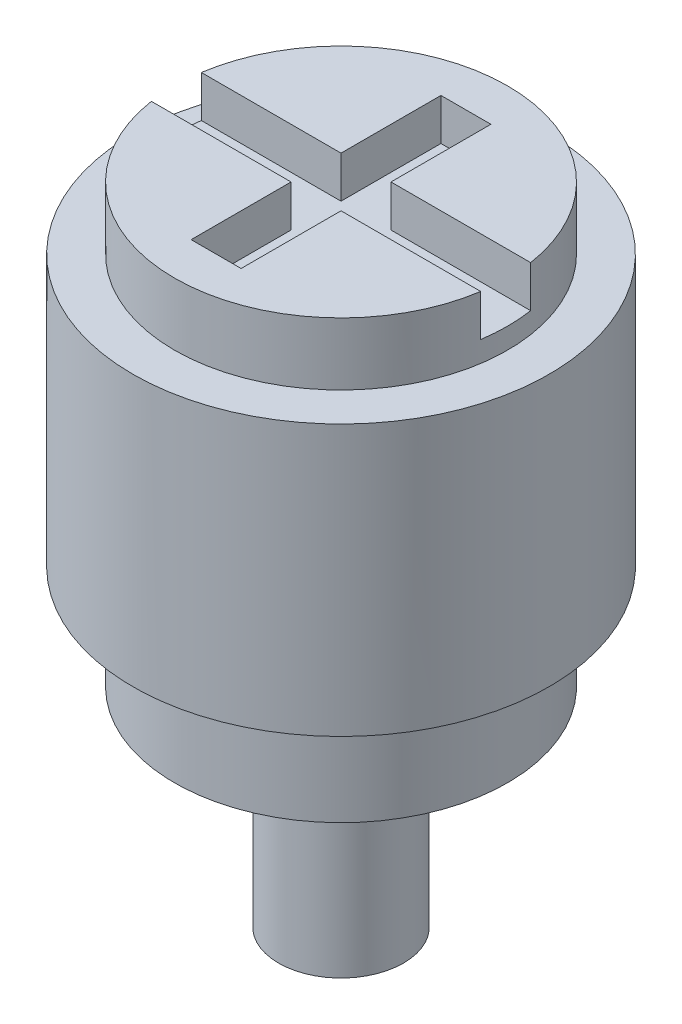
ISO-10303-21;
HEADER;
FILE_DESCRIPTION(('STEP AP214'),'2;1');
FILE_NAME('part.step','',(''),(''),'','','');
FILE_SCHEMA(('AUTOMOTIVE_DESIGN { 1 0 10303 214 1 1 1 1 }'));
ENDSEC;
DATA;
#1=APPLICATION_CONTEXT('core data for automotive mechanical design processes');
#2=APPLICATION_PROTOCOL_DEFINITION('international standard','automotive_design',2000,#1);
#3=PRODUCT_CONTEXT('',#1,'mechanical');
#4=PRODUCT('Part','Part','',(#3));
#5=PRODUCT_RELATED_PRODUCT_CATEGORY('part','',(#4));
#6=PRODUCT_DEFINITION_FORMATION('','',#4);
#7=PRODUCT_DEFINITION_CONTEXT('part definition',#1,'design');
#8=PRODUCT_DEFINITION('design','',#6,#7);
#9=PRODUCT_DEFINITION_SHAPE('','',#8);
#10=(LENGTH_UNIT() NAMED_UNIT(*) SI_UNIT(.MILLI.,.METRE.));
#11=(NAMED_UNIT(*) PLANE_ANGLE_UNIT() SI_UNIT($,.RADIAN.));
#12=(NAMED_UNIT(*) SI_UNIT($,.STERADIAN.) SOLID_ANGLE_UNIT());
#13=UNCERTAINTY_MEASURE_WITH_UNIT(LENGTH_MEASURE(1.E-05),#10,'distance_accuracy_value','');
#14=(GEOMETRIC_REPRESENTATION_CONTEXT(3) GLOBAL_UNCERTAINTY_ASSIGNED_CONTEXT((#13)) GLOBAL_UNIT_ASSIGNED_CONTEXT((#10,
#11,#12)) REPRESENTATION_CONTEXT('',''));
#15=CARTESIAN_POINT('',(0.,0.,0.));
#16=DIRECTION('',(0.,0.,1.));
#17=DIRECTION('',(1.,0.,0.));
#18=AXIS2_PLACEMENT_3D('',#15,#16,#17);
#19=CARTESIAN_POINT('',(0.,5.,0.));
#20=DIRECTION('',(0.,1.,0.));
#21=DIRECTION('',(0.,0.,1.));
#22=AXIS2_PLACEMENT_3D('',#19,#20,#21);
#23=PLANE('',#22);
#24=CARTESIAN_POINT('',(0.,5.,0.));
#25=DIRECTION('',(0.,-1.,0.));
#26=DIRECTION('',(0.,0.,-1.));
#27=AXIS2_PLACEMENT_3D('',#24,#25,#26);
#28=CIRCLE('',#27,3.);
#29=CARTESIAN_POINT('',(0.,5.,-3.));
#30=VERTEX_POINT('',#29);
#31=EDGE_CURVE('E256',#30,#30,#28,.T.);
#32=ORIENTED_EDGE('',*,*,#31,.F.);
#33=EDGE_LOOP('',(#32));
#34=FACE_BOUND('',#33,.T.);
#35=CARTESIAN_POINT('',(0.,5.,0.));
#36=DIRECTION('',(0.,-1.,0.));
#37=DIRECTION('',(0.,0.,-1.));
#38=AXIS2_PLACEMENT_3D('',#35,#36,#37);
#39=CIRCLE('',#38,4.);
#40=CARTESIAN_POINT('',(0.,5.,-4.));
#41=VERTEX_POINT('',#40);
#42=EDGE_CURVE('E265',#41,#41,#39,.T.);
#43=ORIENTED_EDGE('',*,*,#42,.T.);
#44=EDGE_LOOP('',(#43));
#45=FACE_BOUND('',#44,.T.);
#46=ADVANCED_FACE('F33',(#34,#45),#23,.F.);
#47=CARTESIAN_POINT('',(0.,7.,0.));
#48=DIRECTION('',(0.,-1.,0.));
#49=DIRECTION('',(0.,0.,-1.));
#50=AXIS2_PLACEMENT_3D('',#47,#48,#49);
#51=CYLINDRICAL_SURFACE('',#50,3.);
#52=CARTESIAN_POINT('',(0.,7.,0.));
#53=DIRECTION('',(0.,-1.,0.));
#54=DIRECTION('',(0.,0.,-1.));
#55=AXIS2_PLACEMENT_3D('',#52,#53,#54);
#56=CIRCLE('',#55,3.);
#57=CARTESIAN_POINT('',(0.,7.,-3.));
#58=VERTEX_POINT('',#57);
#59=EDGE_CURVE('E254',#58,#58,#56,.T.);
#60=ORIENTED_EDGE('',*,*,#59,.F.);
#61=EDGE_LOOP('',(#60));
#62=FACE_BOUND('',#61,.T.);
#63=ORIENTED_EDGE('',*,*,#31,.T.);
#64=EDGE_LOOP('',(#63));
#65=FACE_BOUND('',#64,.T.);
#66=ADVANCED_FACE('F290',(#62,#65),#51,.F.);
#67=CARTESIAN_POINT('',(0.,7.,0.));
#68=DIRECTION('',(0.,-1.,0.));
#69=DIRECTION('',(0.,0.,-1.));
#70=AXIS2_PLACEMENT_3D('',#67,#68,#69);
#71=PLANE('',#70);
#72=CARTESIAN_POINT('',(0.,7.,0.));
#73=DIRECTION('',(0.,-1.,0.));
#74=DIRECTION('',(0.,0.,-1.));
#75=AXIS2_PLACEMENT_3D('',#72,#73,#74);
#76=CIRCLE('',#75,1.5);
#77=CARTESIAN_POINT('',(0.,7.,-1.5));
#78=VERTEX_POINT('',#77);
#79=EDGE_CURVE('E261',#78,#78,#76,.T.);
#80=ORIENTED_EDGE('',*,*,#79,.F.);
#81=EDGE_LOOP('',(#80));
#82=FACE_BOUND('',#81,.T.);
#83=ORIENTED_EDGE('',*,*,#59,.T.);
#84=EDGE_LOOP('',(#83));
#85=FACE_BOUND('',#84,.T.);
#86=ADVANCED_FACE('F295',(#82,#85),#71,.T.);
#87=CARTESIAN_POINT('',(0.,0.,0.));
#88=DIRECTION('',(0.,1.,0.));
#89=DIRECTION('',(0.,0.,1.));
#90=AXIS2_PLACEMENT_3D('',#87,#88,#89);
#91=PLANE('',#90);
#92=CARTESIAN_POINT('',(0.,0.,0.));
#93=DIRECTION('',(0.,1.,0.));
#94=DIRECTION('',(0.,0.,1.));
#95=AXIS2_PLACEMENT_3D('',#92,#93,#94);
#96=CIRCLE('',#95,1.5);
#97=CARTESIAN_POINT('',(0.,0.,1.5));
#98=VERTEX_POINT('',#97);
#99=EDGE_CURVE('E199',#98,#98,#96,.T.);
#100=ORIENTED_EDGE('',*,*,#99,.F.);
#101=EDGE_LOOP('',(#100));
#102=FACE_BOUND('',#101,.T.);
#103=ADVANCED_FACE('F323',(#102),#91,.F.);
#104=CARTESIAN_POINT('',(0.,5.,0.));
#105=DIRECTION('',(0.,-1.,0.));
#106=DIRECTION('',(0.,0.,-1.));
#107=AXIS2_PLACEMENT_3D('',#104,#105,#106);
#108=CYLINDRICAL_SURFACE('',#107,1.5);
#109=ORIENTED_EDGE('',*,*,#99,.T.);
#110=EDGE_LOOP('',(#109));
#111=FACE_BOUND('',#110,.T.);
#112=ORIENTED_EDGE('',*,*,#79,.T.);
#113=EDGE_LOOP('',(#112));
#114=FACE_BOUND('',#113,.T.);
#115=ADVANCED_FACE('F35',(#111,#114),#108,.T.);
#116=CARTESIAN_POINT('',(0.,7.5,0.));
#117=DIRECTION('',(0.,-1.,0.));
#118=DIRECTION('',(0.,0.,-1.));
#119=AXIS2_PLACEMENT_3D('',#116,#117,#118);
#120=PLANE('',#119);
#121=CARTESIAN_POINT('',(0.,7.5,0.));
#122=DIRECTION('',(0.,-1.,0.));
#123=DIRECTION('',(0.,0.,-1.));
#124=AXIS2_PLACEMENT_3D('',#121,#122,#123);
#125=CIRCLE('',#124,4.);
#126=CARTESIAN_POINT('',(0.,7.5,-4.));
#127=VERTEX_POINT('',#126);
#128=EDGE_CURVE('E268',#127,#127,#125,.T.);
#129=ORIENTED_EDGE('',*,*,#128,.F.);
#130=EDGE_LOOP('',(#129));
#131=FACE_BOUND('',#130,.T.);
#132=CARTESIAN_POINT('',(0.,7.5,0.));
#133=DIRECTION('',(0.,-1.,0.));
#134=DIRECTION('',(0.,0.,-1.));
#135=AXIS2_PLACEMENT_3D('',#132,#133,#134);
#136=CIRCLE('',#135,5.);
#137=CARTESIAN_POINT('',(0.,7.5,-5.));
#138=VERTEX_POINT('',#137);
#139=EDGE_CURVE('E37',#138,#138,#136,.T.);
#140=ORIENTED_EDGE('',*,*,#139,.T.);
#141=EDGE_LOOP('',(#140));
#142=FACE_BOUND('',#141,.T.);
#143=ADVANCED_FACE('F275',(#131,#142),#120,.T.);
#144=CARTESIAN_POINT('',(0.,7.5,0.));
#145=DIRECTION('',(0.,-1.,0.));
#146=DIRECTION('',(0.,0.,-1.));
#147=AXIS2_PLACEMENT_3D('',#144,#145,#146);
#148=CYLINDRICAL_SURFACE('',#147,4.);
#149=ORIENTED_EDGE('',*,*,#128,.T.);
#150=EDGE_LOOP('',(#149));
#151=FACE_BOUND('',#150,.T.);
#152=ORIENTED_EDGE('',*,*,#42,.F.);
#153=EDGE_LOOP('',(#152));
#154=FACE_BOUND('',#153,.T.);
#155=ADVANCED_FACE('F327',(#151,#154),#148,.T.);
#156=CARTESIAN_POINT('',(0.6,14.5,-3.));
#157=DIRECTION('',(1.,0.,0.));
#158=DIRECTION('',(0.,0.,-1.));
#159=AXIS2_PLACEMENT_3D('',#156,#157,#158);
#160=PLANE('',#159);
#161=DIRECTION('',(0.,0.,-1.));
#162=VECTOR('',#161,1.);
#163=CARTESIAN_POINT('',(0.6,14.5,-3.));
#164=LINE('',#163,#162);
#165=CARTESIAN_POINT('',(0.599999999999999,14.5,3.));
#166=VERTEX_POINT('',#165);
#167=CARTESIAN_POINT('',(0.6,14.5,0.6));
#168=VERTEX_POINT('',#167);
#169=EDGE_CURVE('E56',#166,#168,#164,.T.);
#170=ORIENTED_EDGE('',*,*,#169,.F.);
#171=DIRECTION('',(0.,1.,0.));
#172=VECTOR('',#171,1.);
#173=CARTESIAN_POINT('',(0.599999999999999,14.5,3.));
#174=LINE('',#173,#172);
#175=CARTESIAN_POINT('',(0.599999999999999,15.5,3.));
#176=VERTEX_POINT('',#175);
#177=EDGE_CURVE('E141',#166,#176,#174,.T.);
#178=ORIENTED_EDGE('',*,*,#177,.T.);
#179=DIRECTION('',(0.,0.,-1.));
#180=VECTOR('',#179,1.);
#181=CARTESIAN_POINT('',(0.6,15.5,-3.));
#182=LINE('',#181,#180);
#183=CARTESIAN_POINT('',(0.599999999999999,15.5,0.6));
#184=VERTEX_POINT('',#183);
#185=EDGE_CURVE('E156',#176,#184,#182,.T.);
#186=ORIENTED_EDGE('',*,*,#185,.T.);
#187=DIRECTION('',(0.,1.,0.));
#188=VECTOR('',#187,1.);
#189=CARTESIAN_POINT('',(0.599999999999999,14.5,0.6));
#190=LINE('',#189,#188);
#191=EDGE_CURVE('E42',#168,#184,#190,.T.);
#192=ORIENTED_EDGE('',*,*,#191,.F.);
#193=EDGE_LOOP('',(#170,#178,#186,#192));
#194=FACE_BOUND('',#193,.T.);
#195=ADVANCED_FACE('F316',(#194),#160,.F.);
#196=CARTESIAN_POINT('',(-0.599999999999999,14.5,3.));
#197=DIRECTION('',(0.,0.,1.));
#198=DIRECTION('',(1.,0.,0.));
#199=AXIS2_PLACEMENT_3D('',#196,#197,#198);
#200=PLANE('',#199);
#201=DIRECTION('',(1.,0.,0.));
#202=VECTOR('',#201,1.);
#203=CARTESIAN_POINT('',(-0.599999999999999,15.5,3.));
#204=LINE('',#203,#202);
#205=CARTESIAN_POINT('',(-0.599999999999999,15.5,3.));
#206=VERTEX_POINT('',#205);
#207=EDGE_CURVE('E153',#206,#176,#204,.T.);
#208=ORIENTED_EDGE('',*,*,#207,.T.);
#209=ORIENTED_EDGE('',*,*,#177,.F.);
#210=DIRECTION('',(1.,0.,0.));
#211=VECTOR('',#210,1.);
#212=CARTESIAN_POINT('',(-0.599999999999999,14.5,3.));
#213=LINE('',#212,#211);
#214=CARTESIAN_POINT('',(-0.599999999999999,14.5,3.));
#215=VERTEX_POINT('',#214);
#216=EDGE_CURVE('E127',#215,#166,#213,.T.);
#217=ORIENTED_EDGE('',*,*,#216,.F.);
#218=DIRECTION('',(0.,1.,0.));
#219=VECTOR('',#218,1.);
#220=CARTESIAN_POINT('',(-0.599999999999999,14.5,3.));
#221=LINE('',#220,#219);
#222=EDGE_CURVE('E134',#215,#206,#221,.T.);
#223=ORIENTED_EDGE('',*,*,#222,.T.);
#224=EDGE_LOOP('',(#208,#209,#217,#223));
#225=FACE_BOUND('',#224,.T.);
#226=ADVANCED_FACE('F144',(#225),#200,.F.);
#227=CARTESIAN_POINT('',(-0.6,14.5,-3.));
#228=DIRECTION('',(-1.,0.,0.));
#229=DIRECTION('',(0.,0.,1.));
#230=AXIS2_PLACEMENT_3D('',#227,#228,#229);
#231=PLANE('',#230);
#232=DIRECTION('',(0.,0.,1.));
#233=VECTOR('',#232,1.);
#234=CARTESIAN_POINT('',(-0.6,15.5,-3.));
#235=LINE('',#234,#233);
#236=CARTESIAN_POINT('',(-0.599999999999999,15.5,0.6));
#237=VERTEX_POINT('',#236);
#238=EDGE_CURVE('E137',#237,#206,#235,.T.);
#239=ORIENTED_EDGE('',*,*,#238,.T.);
#240=ORIENTED_EDGE('',*,*,#222,.F.);
#241=DIRECTION('',(0.,0.,1.));
#242=VECTOR('',#241,1.);
#243=CARTESIAN_POINT('',(-0.6,14.5,-3.));
#244=LINE('',#243,#242);
#245=CARTESIAN_POINT('',(-0.599999999999999,14.5,0.6));
#246=VERTEX_POINT('',#245);
#247=EDGE_CURVE('E122',#246,#215,#244,.T.);
#248=ORIENTED_EDGE('',*,*,#247,.F.);
#249=DIRECTION('',(0.,-1.,0.));
#250=VECTOR('',#249,1.);
#251=CARTESIAN_POINT('',(-0.599999999999999,14.5,0.6));
#252=LINE('',#251,#250);
#253=EDGE_CURVE('E12',#237,#246,#252,.T.);
#254=ORIENTED_EDGE('',*,*,#253,.F.);
#255=EDGE_LOOP('',(#239,#240,#248,#254));
#256=FACE_BOUND('',#255,.T.);
#257=ADVANCED_FACE('F135',(#256),#231,.F.);
#258=CARTESIAN_POINT('',(0.6,15.5,-0.6));
#259=VERTEX_POINT('',#258);
#260=CARTESIAN_POINT('',(0.6,15.5,-3.));
#261=VERTEX_POINT('',#260);
#262=EDGE_CURVE('E155',#259,#261,#182,.T.);
#263=ORIENTED_EDGE('',*,*,#262,.T.);
#264=DIRECTION('',(0.,1.,0.));
#265=VECTOR('',#264,1.);
#266=CARTESIAN_POINT('',(0.6,14.5,-3.));
#267=LINE('',#266,#265);
#268=CARTESIAN_POINT('',(0.6,14.5,-3.));
#269=VERTEX_POINT('',#268);
#270=EDGE_CURVE('E163',#269,#261,#267,.T.);
#271=ORIENTED_EDGE('',*,*,#270,.F.);
#272=CARTESIAN_POINT('',(0.6,14.5,-0.6));
#273=VERTEX_POINT('',#272);
#274=EDGE_CURVE('E145',#273,#269,#164,.T.);
#275=ORIENTED_EDGE('',*,*,#274,.F.);
#276=DIRECTION('',(0.,-1.,0.));
#277=VECTOR('',#276,1.);
#278=CARTESIAN_POINT('',(0.6,14.5,-0.6));
#279=LINE('',#278,#277);
#280=EDGE_CURVE('E162',#259,#273,#279,.T.);
#281=ORIENTED_EDGE('',*,*,#280,.F.);
#282=EDGE_LOOP('',(#263,#271,#275,#281));
#283=FACE_BOUND('',#282,.T.);
#284=ADVANCED_FACE('F238',(#283),#160,.F.);
#285=CARTESIAN_POINT('',(-0.6,14.5,-3.));
#286=DIRECTION('',(0.,0.,-1.));
#287=DIRECTION('',(-1.,0.,0.));
#288=AXIS2_PLACEMENT_3D('',#285,#286,#287);
#289=PLANE('',#288);
#290=DIRECTION('',(-1.,0.,0.));
#291=VECTOR('',#290,1.);
#292=CARTESIAN_POINT('',(-0.6,15.5,-3.));
#293=LINE('',#292,#291);
#294=CARTESIAN_POINT('',(-0.6,15.5,-3.));
#295=VERTEX_POINT('',#294);
#296=EDGE_CURVE('E131',#261,#295,#293,.T.);
#297=ORIENTED_EDGE('',*,*,#296,.T.);
#298=DIRECTION('',(0.,1.,0.));
#299=VECTOR('',#298,1.);
#300=CARTESIAN_POINT('',(-0.6,14.5,-3.));
#301=LINE('',#300,#299);
#302=CARTESIAN_POINT('',(-0.6,14.5,-3.));
#303=VERTEX_POINT('',#302);
#304=EDGE_CURVE('E160',#303,#295,#301,.T.);
#305=ORIENTED_EDGE('',*,*,#304,.F.);
#306=DIRECTION('',(-1.,0.,0.));
#307=VECTOR('',#306,1.);
#308=CARTESIAN_POINT('',(-0.6,14.5,-3.));
#309=LINE('',#308,#307);
#310=EDGE_CURVE('E142',#269,#303,#309,.T.);
#311=ORIENTED_EDGE('',*,*,#310,.F.);
#312=ORIENTED_EDGE('',*,*,#270,.T.);
#313=EDGE_LOOP('',(#297,#305,#311,#312));
#314=FACE_BOUND('',#313,.T.);
#315=ADVANCED_FACE('F241',(#314),#289,.F.);
#316=CARTESIAN_POINT('',(-0.6,14.5,-0.6));
#317=VERTEX_POINT('',#316);
#318=EDGE_CURVE('E49',#303,#317,#244,.T.);
#319=ORIENTED_EDGE('',*,*,#318,.F.);
#320=ORIENTED_EDGE('',*,*,#304,.T.);
#321=CARTESIAN_POINT('',(-0.6,15.5,-0.6));
#322=VERTEX_POINT('',#321);
#323=EDGE_CURVE('E151',#295,#322,#235,.T.);
#324=ORIENTED_EDGE('',*,*,#323,.T.);
#325=DIRECTION('',(0.,1.,0.));
#326=VECTOR('',#325,1.);
#327=CARTESIAN_POINT('',(-0.599999999999999,14.5,-0.6));
#328=LINE('',#327,#326);
#329=EDGE_CURVE('E169',#317,#322,#328,.T.);
#330=ORIENTED_EDGE('',*,*,#329,.F.);
#331=EDGE_LOOP('',(#319,#320,#324,#330));
#332=FACE_BOUND('',#331,.T.);
#333=ADVANCED_FACE('F243',(#332),#231,.F.);
#334=CARTESIAN_POINT('',(-4.18213000388271,14.5,-0.6));
#335=DIRECTION('',(0.,0.,-1.));
#336=DIRECTION('',(-1.,0.,0.));
#337=AXIS2_PLACEMENT_3D('',#334,#335,#336);
#338=PLANE('',#337);
#339=DIRECTION('',(-1.,0.,0.));
#340=VECTOR('',#339,1.);
#341=CARTESIAN_POINT('',(-4.18213000388271,14.5,-0.6));
#342=LINE('',#341,#340);
#343=CARTESIAN_POINT('',(-3.95474398665704,14.5,-0.6));
#344=VERTEX_POINT('',#343);
#345=EDGE_CURVE('E174',#317,#344,#342,.T.);
#346=ORIENTED_EDGE('',*,*,#345,.F.);
#347=ORIENTED_EDGE('',*,*,#329,.T.);
#348=DIRECTION('',(-1.,0.,0.));
#349=VECTOR('',#348,1.);
#350=CARTESIAN_POINT('',(0.,15.5,-0.6));
#351=LINE('',#350,#349);
#352=CARTESIAN_POINT('',(-3.95474398665704,15.5,-0.6));
#353=VERTEX_POINT('',#352);
#354=EDGE_CURVE('E206',#322,#353,#351,.T.);
#355=ORIENTED_EDGE('',*,*,#354,.T.);
#356=DIRECTION('',(0.,-1.,0.));
#357=VECTOR('',#356,1.);
#358=CARTESIAN_POINT('',(-3.95474398665704,15.5,-0.6));
#359=LINE('',#358,#357);
#360=EDGE_CURVE('E183',#344,#353,#359,.F.);
#361=ORIENTED_EDGE('',*,*,#360,.F.);
#362=EDGE_LOOP('',(#346,#347,#355,#361));
#363=FACE_BOUND('',#362,.T.);
#364=ADVANCED_FACE('F246',(#363),#338,.F.);
#365=CARTESIAN_POINT('',(-4.18213000388271,14.5,0.6));
#366=DIRECTION('',(0.,0.,1.));
#367=DIRECTION('',(1.,0.,0.));
#368=AXIS2_PLACEMENT_3D('',#365,#366,#367);
#369=PLANE('',#368);
#370=DIRECTION('',(1.,0.,0.));
#371=VECTOR('',#370,1.);
#372=CARTESIAN_POINT('',(0.,15.5,0.6));
#373=LINE('',#372,#371);
#374=CARTESIAN_POINT('',(-3.95474398665704,15.5,0.6));
#375=VERTEX_POINT('',#374);
#376=EDGE_CURVE('E203',#375,#237,#373,.T.);
#377=ORIENTED_EDGE('',*,*,#376,.T.);
#378=ORIENTED_EDGE('',*,*,#253,.T.);
#379=DIRECTION('',(1.,0.,0.));
#380=VECTOR('',#379,1.);
#381=CARTESIAN_POINT('',(-4.18213000388271,14.5,0.6));
#382=LINE('',#381,#380);
#383=CARTESIAN_POINT('',(-3.95474398665704,14.5,0.6));
#384=VERTEX_POINT('',#383);
#385=EDGE_CURVE('E129',#384,#246,#382,.T.);
#386=ORIENTED_EDGE('',*,*,#385,.F.);
#387=DIRECTION('',(0.,-1.,0.));
#388=VECTOR('',#387,1.);
#389=CARTESIAN_POINT('',(-3.95474398665704,15.5,0.6));
#390=LINE('',#389,#388);
#391=EDGE_CURVE('E180',#375,#384,#390,.T.);
#392=ORIENTED_EDGE('',*,*,#391,.F.);
#393=EDGE_LOOP('',(#377,#378,#386,#392));
#394=FACE_BOUND('',#393,.T.);
#395=ADVANCED_FACE('F248',(#394),#369,.F.);
#396=CARTESIAN_POINT('',(0.,15.5,0.));
#397=DIRECTION('',(0.,1.,0.));
#398=DIRECTION('',(0.,0.,1.));
#399=AXIS2_PLACEMENT_3D('',#396,#397,#398);
#400=PLANE('',#399);
#401=ORIENTED_EDGE('',*,*,#238,.F.);
#402=ORIENTED_EDGE('',*,*,#376,.F.);
#403=CARTESIAN_POINT('',(0.,15.5,0.));
#404=DIRECTION('',(0.,1.,0.));
#405=DIRECTION('',(0.,0.,1.));
#406=AXIS2_PLACEMENT_3D('',#403,#404,#405);
#407=CIRCLE('',#406,4.);
#408=CARTESIAN_POINT('',(3.95474398665704,15.5,0.6));
#409=VERTEX_POINT('',#408);
#410=EDGE_CURVE('E190',#375,#409,#407,.T.);
#411=ORIENTED_EDGE('',*,*,#410,.T.);
#412=EDGE_CURVE('E202',#184,#409,#373,.T.);
#413=ORIENTED_EDGE('',*,*,#412,.F.);
#414=ORIENTED_EDGE('',*,*,#185,.F.);
#415=ORIENTED_EDGE('',*,*,#207,.F.);
#416=EDGE_LOOP('',(#401,#402,#411,#413,#414,#415));
#417=FACE_BOUND('',#416,.T.);
#418=ADVANCED_FACE('F252',(#417),#400,.T.);
#419=CARTESIAN_POINT('',(3.95474398665704,14.5,0.6));
#420=VERTEX_POINT('',#419);
#421=EDGE_CURVE('E172',#168,#420,#382,.T.);
#422=ORIENTED_EDGE('',*,*,#421,.F.);
#423=ORIENTED_EDGE('',*,*,#191,.T.);
#424=ORIENTED_EDGE('',*,*,#412,.T.);
#425=DIRECTION('',(0.,-1.,0.));
#426=VECTOR('',#425,1.);
#427=CARTESIAN_POINT('',(3.95474398665704,15.5,0.6));
#428=LINE('',#427,#426);
#429=EDGE_CURVE('E177',#420,#409,#428,.F.);
#430=ORIENTED_EDGE('',*,*,#429,.F.);
#431=EDGE_LOOP('',(#422,#423,#424,#430));
#432=FACE_BOUND('',#431,.T.);
#433=ADVANCED_FACE('F305',(#432),#369,.F.);
#434=CARTESIAN_POINT('',(-4.18213000388271,14.5,0.6));
#435=DIRECTION('',(0.,1.,0.));
#436=DIRECTION('',(0.,0.,1.));
#437=AXIS2_PLACEMENT_3D('',#434,#435,#436);
#438=PLANE('',#437);
#439=CARTESIAN_POINT('',(3.95474398665704,14.5,-0.6));
#440=VERTEX_POINT('',#439);
#441=EDGE_CURVE('E175',#440,#273,#342,.T.);
#442=ORIENTED_EDGE('',*,*,#441,.T.);
#443=ORIENTED_EDGE('',*,*,#274,.T.);
#444=ORIENTED_EDGE('',*,*,#310,.T.);
#445=ORIENTED_EDGE('',*,*,#318,.T.);
#446=ORIENTED_EDGE('',*,*,#345,.T.);
#447=CARTESIAN_POINT('',(0.,14.5,0.));
#448=DIRECTION('',(0.,1.,0.));
#449=DIRECTION('',(0.,0.,1.));
#450=AXIS2_PLACEMENT_3D('',#447,#448,#449);
#451=CIRCLE('',#450,4.);
#452=EDGE_CURVE('E210',#344,#384,#451,.T.);
#453=ORIENTED_EDGE('',*,*,#452,.T.);
#454=ORIENTED_EDGE('',*,*,#385,.T.);
#455=ORIENTED_EDGE('',*,*,#247,.T.);
#456=ORIENTED_EDGE('',*,*,#216,.T.);
#457=ORIENTED_EDGE('',*,*,#169,.T.);
#458=ORIENTED_EDGE('',*,*,#421,.T.);
#459=EDGE_CURVE('E212',#420,#440,#451,.T.);
#460=ORIENTED_EDGE('',*,*,#459,.T.);
#461=EDGE_LOOP('',(#442,#443,#444,#445,#446,#453,#454,#455,#456,#457,#458,#460));
#462=FACE_BOUND('',#461,.T.);
#463=ADVANCED_FACE('F125',(#462),#438,.T.);
#464=CARTESIAN_POINT('',(3.95474398665704,15.5,-0.6));
#465=VERTEX_POINT('',#464);
#466=EDGE_CURVE('E207',#465,#259,#351,.T.);
#467=ORIENTED_EDGE('',*,*,#466,.T.);
#468=ORIENTED_EDGE('',*,*,#280,.T.);
#469=ORIENTED_EDGE('',*,*,#441,.F.);
#470=DIRECTION('',(0.,-1.,0.));
#471=VECTOR('',#470,1.);
#472=CARTESIAN_POINT('',(3.95474398665704,15.5,-0.6));
#473=LINE('',#472,#471);
#474=EDGE_CURVE('E186',#465,#440,#473,.T.);
#475=ORIENTED_EDGE('',*,*,#474,.F.);
#476=EDGE_LOOP('',(#467,#468,#469,#475));
#477=FACE_BOUND('',#476,.T.);
#478=ADVANCED_FACE('F222',(#477),#338,.F.);
#479=ORIENTED_EDGE('',*,*,#323,.F.);
#480=ORIENTED_EDGE('',*,*,#296,.F.);
#481=ORIENTED_EDGE('',*,*,#262,.F.);
#482=ORIENTED_EDGE('',*,*,#466,.F.);
#483=EDGE_CURVE('E193',#465,#353,#407,.T.);
#484=ORIENTED_EDGE('',*,*,#483,.T.);
#485=ORIENTED_EDGE('',*,*,#354,.F.);
#486=EDGE_LOOP('',(#479,#480,#481,#482,#484,#485));
#487=FACE_BOUND('',#486,.T.);
#488=ADVANCED_FACE('F233',(#487),#400,.T.);
#489=CARTESIAN_POINT('',(0.,15.5,0.));
#490=DIRECTION('',(0.,-1.,0.));
#491=DIRECTION('',(0.,0.,-1.));
#492=AXIS2_PLACEMENT_3D('',#489,#490,#491);
#493=CYLINDRICAL_SURFACE('',#492,4.);
#494=ORIENTED_EDGE('',*,*,#483,.F.);
#495=ORIENTED_EDGE('',*,*,#474,.T.);
#496=ORIENTED_EDGE('',*,*,#459,.F.);
#497=ORIENTED_EDGE('',*,*,#429,.T.);
#498=ORIENTED_EDGE('',*,*,#410,.F.);
#499=ORIENTED_EDGE('',*,*,#391,.T.);
#500=ORIENTED_EDGE('',*,*,#452,.F.);
#501=ORIENTED_EDGE('',*,*,#360,.T.);
#502=EDGE_LOOP('',(#494,#495,#496,#497,#498,#499,#500,#501));
#503=FACE_BOUND('',#502,.T.);
#504=CARTESIAN_POINT('',(0.,14.,0.));
#505=DIRECTION('',(0.,1.,0.));
#506=DIRECTION('',(0.,0.,1.));
#507=AXIS2_PLACEMENT_3D('',#504,#505,#506);
#508=CIRCLE('',#507,4.);
#509=CARTESIAN_POINT('',(0.,14.,4.));
#510=VERTEX_POINT('',#509);
#511=EDGE_CURVE('E189',#510,#510,#508,.T.);
#512=ORIENTED_EDGE('',*,*,#511,.T.);
#513=EDGE_LOOP('',(#512));
#514=FACE_BOUND('',#513,.T.);
#515=ADVANCED_FACE('F225',(#503,#514),#493,.T.);
#516=CARTESIAN_POINT('',(0.,14.,0.));
#517=DIRECTION('',(0.,1.,0.));
#518=DIRECTION('',(0.,0.,1.));
#519=AXIS2_PLACEMENT_3D('',#516,#517,#518);
#520=PLANE('',#519);
#521=CARTESIAN_POINT('',(0.,14.,0.));
#522=DIRECTION('',(0.,1.,0.));
#523=DIRECTION('',(0.,0.,1.));
#524=AXIS2_PLACEMENT_3D('',#521,#522,#523);
#525=CIRCLE('',#524,5.);
#526=CARTESIAN_POINT('',(0.,14.,5.));
#527=VERTEX_POINT('',#526);
#528=EDGE_CURVE('E196',#527,#527,#525,.T.);
#529=ORIENTED_EDGE('',*,*,#528,.T.);
#530=EDGE_LOOP('',(#529));
#531=FACE_BOUND('',#530,.T.);
#532=ORIENTED_EDGE('',*,*,#511,.F.);
#533=EDGE_LOOP('',(#532));
#534=FACE_BOUND('',#533,.T.);
#535=ADVANCED_FACE('F279',(#531,#534),#520,.T.);
#536=CARTESIAN_POINT('',(0.,14.,0.));
#537=DIRECTION('',(0.,-1.,0.));
#538=DIRECTION('',(0.,0.,-1.));
#539=AXIS2_PLACEMENT_3D('',#536,#537,#538);
#540=CYLINDRICAL_SURFACE('',#539,5.);
#541=ORIENTED_EDGE('',*,*,#528,.F.);
#542=EDGE_LOOP('',(#541));
#543=FACE_BOUND('',#542,.T.);
#544=ORIENTED_EDGE('',*,*,#139,.F.);
#545=EDGE_LOOP('',(#544));
#546=FACE_BOUND('',#545,.T.);
#547=ADVANCED_FACE('F277',(#543,#546),#540,.T.);
#548=CLOSED_SHELL('',(#46,#66,#86,#103,#115,#143,#155,#195,#226,#257,#284,#315,#333,#364,#395,
#418,#433,#463,#478,#488,#515,#535,#547));
#549=MANIFOLD_SOLID_BREP('B2',#548);
#550=ADVANCED_BREP_SHAPE_REPRESENTATION('',(#18,#549),#14);
#551=SHAPE_DEFINITION_REPRESENTATION(#9,#550);
ENDSEC;
END-ISO-10303-21;
